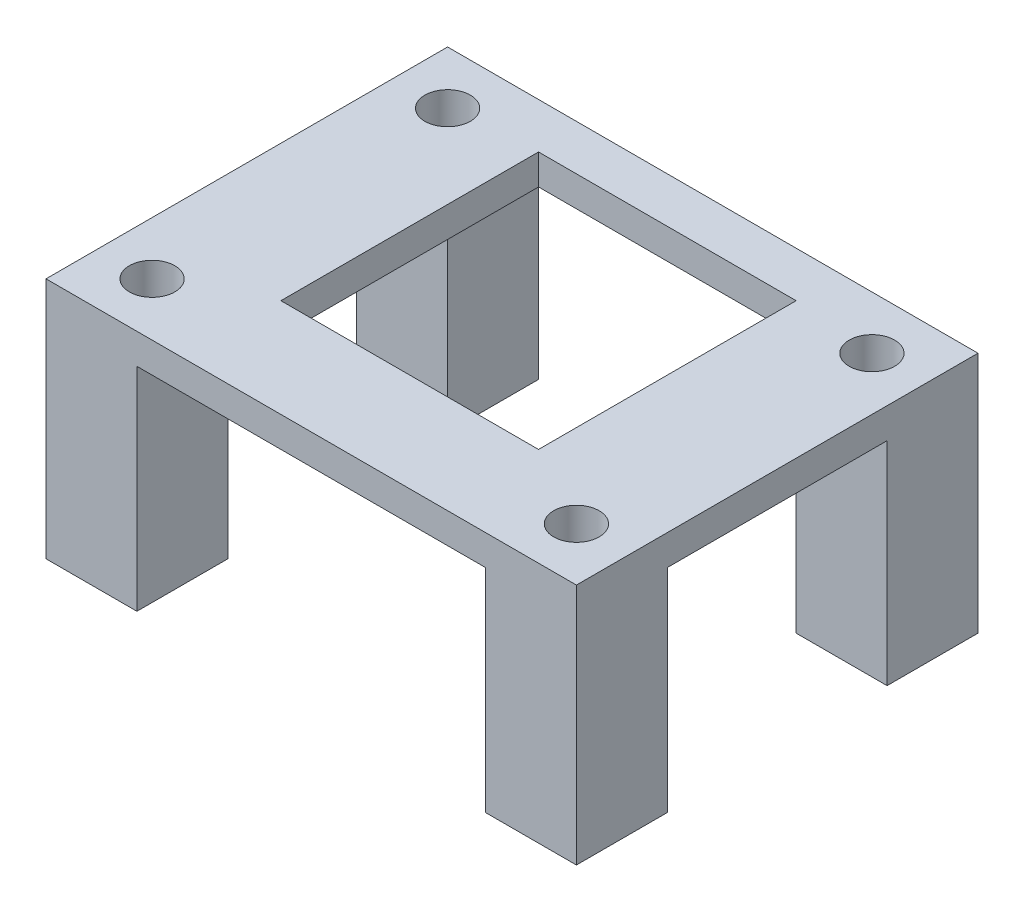
ISO-10303-21;
HEADER;
FILE_DESCRIPTION(('STEP AP214'),'2;1');
FILE_NAME('part.step','',(''),(''),'','','');
FILE_SCHEMA(('AUTOMOTIVE_DESIGN { 1 0 10303 214 1 1 1 1 }'));
ENDSEC;
DATA;
#1=APPLICATION_CONTEXT('core data for automotive mechanical design processes');
#2=APPLICATION_PROTOCOL_DEFINITION('international standard','automotive_design',2000,#1);
#3=PRODUCT_CONTEXT('',#1,'mechanical');
#4=PRODUCT('Part','Part','',(#3));
#5=PRODUCT_RELATED_PRODUCT_CATEGORY('part','',(#4));
#6=PRODUCT_DEFINITION_FORMATION('','',#4);
#7=PRODUCT_DEFINITION_CONTEXT('part definition',#1,'design');
#8=PRODUCT_DEFINITION('design','',#6,#7);
#9=PRODUCT_DEFINITION_SHAPE('','',#8);
#10=(LENGTH_UNIT() NAMED_UNIT(*) SI_UNIT(.MILLI.,.METRE.));
#11=(NAMED_UNIT(*) PLANE_ANGLE_UNIT() SI_UNIT($,.RADIAN.));
#12=(NAMED_UNIT(*) SI_UNIT($,.STERADIAN.) SOLID_ANGLE_UNIT());
#13=UNCERTAINTY_MEASURE_WITH_UNIT(LENGTH_MEASURE(1.E-05),#10,'distance_accuracy_value','');
#14=(GEOMETRIC_REPRESENTATION_CONTEXT(3) GLOBAL_UNCERTAINTY_ASSIGNED_CONTEXT((#13)) GLOBAL_UNIT_ASSIGNED_CONTEXT((#10,
#11,#12)) REPRESENTATION_CONTEXT('',''));
#15=CARTESIAN_POINT('',(0.,0.,0.));
#16=DIRECTION('',(0.,0.,1.));
#17=DIRECTION('',(1.,0.,0.));
#18=AXIS2_PLACEMENT_3D('',#15,#16,#17);
#19=CARTESIAN_POINT('',(0.,5.,0.));
#20=DIRECTION('',(0.,1.,0.));
#21=DIRECTION('',(0.,0.,1.));
#22=AXIS2_PLACEMENT_3D('',#19,#20,#21);
#23=PLANE('',#22);
#24=DIRECTION('',(0.,0.,1.));
#25=VECTOR('',#24,1.);
#26=CARTESIAN_POINT('',(-35.,5.,0.));
#27=LINE('',#26,#25);
#28=CARTESIAN_POINT('',(-35.,5.,-31.25));
#29=VERTEX_POINT('',#28);
#30=CARTESIAN_POINT('',(-35.,5.,-25.25));
#31=VERTEX_POINT('',#30);
#32=EDGE_CURVE('E207',#29,#31,#27,.T.);
#33=ORIENTED_EDGE('',*,*,#32,.F.);
#34=DIRECTION('',(1.,0.,0.));
#35=VECTOR('',#34,1.);
#36=CARTESIAN_POINT('',(0.,5.,-31.25));
#37=LINE('',#36,#35);
#38=CARTESIAN_POINT('',(-29.,5.,-31.25));
#39=VERTEX_POINT('',#38);
#40=EDGE_CURVE('E204',#29,#39,#37,.T.);
#41=ORIENTED_EDGE('',*,*,#40,.T.);
#42=DIRECTION('',(0.,0.,1.));
#43=VECTOR('',#42,1.);
#44=CARTESIAN_POINT('',(-29.,5.,0.));
#45=LINE('',#44,#43);
#46=CARTESIAN_POINT('',(-29.,5.,-25.25));
#47=VERTEX_POINT('',#46);
#48=EDGE_CURVE('E190',#39,#47,#45,.T.);
#49=ORIENTED_EDGE('',*,*,#48,.T.);
#50=DIRECTION('',(1.,0.,0.));
#51=VECTOR('',#50,1.);
#52=CARTESIAN_POINT('',(0.,5.,-25.25));
#53=LINE('',#52,#51);
#54=EDGE_CURVE('E381',#31,#47,#53,.T.);
#55=ORIENTED_EDGE('',*,*,#54,.F.);
#56=EDGE_LOOP('',(#33,#41,#49,#55));
#57=FACE_BOUND('',#56,.T.);
#58=CARTESIAN_POINT('',(-31.5,5.,-27.75));
#59=DIRECTION('',(0.,1.,0.));
#60=DIRECTION('',(0.,0.,1.));
#61=AXIS2_PLACEMENT_3D('',#58,#59,#60);
#62=CIRCLE('',#61,1.5);
#63=CARTESIAN_POINT('',(-31.5,5.,-26.25));
#64=VERTEX_POINT('',#63);
#65=EDGE_CURVE('E49',#64,#64,#62,.T.);
#66=ORIENTED_EDGE('',*,*,#65,.T.);
#67=EDGE_LOOP('',(#66));
#68=FACE_BOUND('',#67,.T.);
#69=ADVANCED_FACE('F45',(#57,#68),#23,.F.);
#70=DIRECTION('',(1.,0.,0.));
#71=VECTOR('',#70,1.);
#72=CARTESIAN_POINT('',(0.,5.,-4.75));
#73=LINE('',#72,#71);
#74=CARTESIAN_POINT('',(-35.,5.,-4.74999999999999));
#75=VERTEX_POINT('',#74);
#76=CARTESIAN_POINT('',(-29.,5.,-4.75));
#77=VERTEX_POINT('',#76);
#78=EDGE_CURVE('E489',#75,#77,#73,.T.);
#79=ORIENTED_EDGE('',*,*,#78,.F.);
#80=CARTESIAN_POINT('',(-35.,5.,-10.75));
#81=VERTEX_POINT('',#80);
#82=EDGE_CURVE('E485',#81,#75,#27,.T.);
#83=ORIENTED_EDGE('',*,*,#82,.F.);
#84=DIRECTION('',(1.,0.,0.));
#85=VECTOR('',#84,1.);
#86=CARTESIAN_POINT('',(0.,5.,-10.75));
#87=LINE('',#86,#85);
#88=CARTESIAN_POINT('',(-29.,5.,-10.75));
#89=VERTEX_POINT('',#88);
#90=EDGE_CURVE('E201',#81,#89,#87,.T.);
#91=ORIENTED_EDGE('',*,*,#90,.T.);
#92=DIRECTION('',(0.,0.,-1.));
#93=VECTOR('',#92,1.);
#94=CARTESIAN_POINT('',(-29.,5.,0.));
#95=LINE('',#94,#93);
#96=EDGE_CURVE('E496',#77,#89,#95,.T.);
#97=ORIENTED_EDGE('',*,*,#96,.F.);
#98=EDGE_LOOP('',(#79,#83,#91,#97));
#99=FACE_BOUND('',#98,.T.);
#100=CARTESIAN_POINT('',(-31.5,5.,-8.25));
#101=DIRECTION('',(0.,1.,0.));
#102=DIRECTION('',(0.,0.,1.));
#103=AXIS2_PLACEMENT_3D('',#100,#101,#102);
#104=CIRCLE('',#103,1.5);
#105=CARTESIAN_POINT('',(-31.5,5.,-6.75));
#106=VERTEX_POINT('',#105);
#107=EDGE_CURVE('E513',#106,#106,#104,.F.);
#108=ORIENTED_EDGE('',*,*,#107,.F.);
#109=EDGE_LOOP('',(#108));
#110=FACE_BOUND('',#109,.T.);
#111=ADVANCED_FACE('F445',(#99,#110),#23,.F.);
#112=CARTESIAN_POINT('',(-3.50000000000001,5.,-8.25));
#113=DIRECTION('',(0.,1.,0.));
#114=DIRECTION('',(0.,0.,1.));
#115=AXIS2_PLACEMENT_3D('',#112,#113,#114);
#116=CIRCLE('',#115,1.5);
#117=CARTESIAN_POINT('',(-3.50000000000001,5.,-6.75));
#118=VERTEX_POINT('',#117);
#119=EDGE_CURVE('E461',#118,#118,#116,.F.);
#120=ORIENTED_EDGE('',*,*,#119,.F.);
#121=EDGE_LOOP('',(#120));
#122=FACE_BOUND('',#121,.T.);
#123=DIRECTION('',(1.,0.,0.));
#124=VECTOR('',#123,1.);
#125=CARTESIAN_POINT('',(0.,5.,-10.75));
#126=LINE('',#125,#124);
#127=CARTESIAN_POINT('',(-6.,5.,-10.75));
#128=VERTEX_POINT('',#127);
#129=CARTESIAN_POINT('',(0.,5.,-10.75));
#130=VERTEX_POINT('',#129);
#131=EDGE_CURVE('E386',#128,#130,#126,.T.);
#132=ORIENTED_EDGE('',*,*,#131,.T.);
#133=DIRECTION('',(0.,0.,1.));
#134=VECTOR('',#133,1.);
#135=CARTESIAN_POINT('',(0.,5.,0.));
#136=LINE('',#135,#134);
#137=CARTESIAN_POINT('',(0.,5.,-4.75));
#138=VERTEX_POINT('',#137);
#139=EDGE_CURVE('E378',#130,#138,#136,.T.);
#140=ORIENTED_EDGE('',*,*,#139,.T.);
#141=CARTESIAN_POINT('',(-6.,5.,-4.75));
#142=VERTEX_POINT('',#141);
#143=EDGE_CURVE('E481',#142,#138,#73,.T.);
#144=ORIENTED_EDGE('',*,*,#143,.F.);
#145=DIRECTION('',(0.,0.,1.));
#146=VECTOR('',#145,1.);
#147=CARTESIAN_POINT('',(-6.,5.,0.));
#148=LINE('',#147,#146);
#149=EDGE_CURVE('E466',#128,#142,#148,.T.);
#150=ORIENTED_EDGE('',*,*,#149,.F.);
#151=EDGE_LOOP('',(#132,#140,#144,#150));
#152=FACE_BOUND('',#151,.T.);
#153=ADVANCED_FACE('F447',(#122,#152),#23,.F.);
#154=CARTESIAN_POINT('',(-3.50000000000001,5.,-27.75));
#155=DIRECTION('',(0.,1.,0.));
#156=DIRECTION('',(0.,0.,1.));
#157=AXIS2_PLACEMENT_3D('',#154,#155,#156);
#158=CIRCLE('',#157,1.5);
#159=CARTESIAN_POINT('',(-3.50000000000001,5.,-26.25));
#160=VERTEX_POINT('',#159);
#161=EDGE_CURVE('E506',#160,#160,#158,.F.);
#162=ORIENTED_EDGE('',*,*,#161,.F.);
#163=EDGE_LOOP('',(#162));
#164=FACE_BOUND('',#163,.T.);
#165=DIRECTION('',(-1.,0.,0.));
#166=VECTOR('',#165,1.);
#167=CARTESIAN_POINT('',(0.,5.,-25.25));
#168=LINE('',#167,#166);
#169=CARTESIAN_POINT('',(0.,5.,-25.25));
#170=VERTEX_POINT('',#169);
#171=CARTESIAN_POINT('',(-6.,5.,-25.25));
#172=VERTEX_POINT('',#171);
#173=EDGE_CURVE('E212',#170,#172,#168,.T.);
#174=ORIENTED_EDGE('',*,*,#173,.T.);
#175=DIRECTION('',(0.,0.,1.));
#176=VECTOR('',#175,1.);
#177=CARTESIAN_POINT('',(-5.99999999999998,5.,0.));
#178=LINE('',#177,#176);
#179=CARTESIAN_POINT('',(-6.,5.,-31.25));
#180=VERTEX_POINT('',#179);
#181=EDGE_CURVE('E491',#180,#172,#178,.T.);
#182=ORIENTED_EDGE('',*,*,#181,.F.);
#183=CARTESIAN_POINT('',(0.,5.,-31.25));
#184=VERTEX_POINT('',#183);
#185=EDGE_CURVE('E213',#180,#184,#37,.T.);
#186=ORIENTED_EDGE('',*,*,#185,.T.);
#187=EDGE_CURVE('E200',#184,#170,#136,.T.);
#188=ORIENTED_EDGE('',*,*,#187,.T.);
#189=EDGE_LOOP('',(#174,#182,#186,#188));
#190=FACE_BOUND('',#189,.T.);
#191=ADVANCED_FACE('F446',(#164,#190),#23,.F.);
#192=CARTESIAN_POINT('',(0.,0.,0.));
#193=DIRECTION('',(1.,0.,0.));
#194=DIRECTION('',(0.,0.,-1.));
#195=AXIS2_PLACEMENT_3D('',#192,#193,#194);
#196=PLANE('',#195);
#197=ORIENTED_EDGE('',*,*,#139,.F.);
#198=DIRECTION('',(0.,1.,0.));
#199=VECTOR('',#198,1.);
#200=CARTESIAN_POINT('',(0.,0.,-10.75));
#201=LINE('',#200,#199);
#202=CARTESIAN_POINT('',(0.,19.,-10.75));
#203=VERTEX_POINT('',#202);
#204=EDGE_CURVE('E265',#130,#203,#201,.T.);
#205=ORIENTED_EDGE('',*,*,#204,.T.);
#206=DIRECTION('',(0.,0.,-1.));
#207=VECTOR('',#206,1.);
#208=CARTESIAN_POINT('',(0.,19.,-10.75));
#209=LINE('',#208,#207);
#210=CARTESIAN_POINT('',(0.,19.,-25.25));
#211=VERTEX_POINT('',#210);
#212=EDGE_CURVE('E301',#203,#211,#209,.T.);
#213=ORIENTED_EDGE('',*,*,#212,.T.);
#214=DIRECTION('',(0.,-1.,0.));
#215=VECTOR('',#214,1.);
#216=CARTESIAN_POINT('',(0.,21.,-25.25));
#217=LINE('',#216,#215);
#218=EDGE_CURVE('E286',#211,#170,#217,.T.);
#219=ORIENTED_EDGE('',*,*,#218,.T.);
#220=ORIENTED_EDGE('',*,*,#187,.F.);
#221=DIRECTION('',(0.,-1.,0.));
#222=VECTOR('',#221,1.);
#223=CARTESIAN_POINT('',(0.,21.,-31.25));
#224=LINE('',#223,#222);
#225=CARTESIAN_POINT('',(0.,21.,-31.25));
#226=VERTEX_POINT('',#225);
#227=EDGE_CURVE('E290',#226,#184,#224,.T.);
#228=ORIENTED_EDGE('',*,*,#227,.F.);
#229=DIRECTION('',(0.,0.,-1.));
#230=VECTOR('',#229,1.);
#231=CARTESIAN_POINT('',(0.,21.,0.));
#232=LINE('',#231,#230);
#233=CARTESIAN_POINT('',(0.,21.,-4.75));
#234=VERTEX_POINT('',#233);
#235=EDGE_CURVE('E269',#234,#226,#232,.T.);
#236=ORIENTED_EDGE('',*,*,#235,.F.);
#237=DIRECTION('',(0.,1.,0.));
#238=VECTOR('',#237,1.);
#239=CARTESIAN_POINT('',(0.,0.,-4.75));
#240=LINE('',#239,#238);
#241=EDGE_CURVE('E264',#138,#234,#240,.T.);
#242=ORIENTED_EDGE('',*,*,#241,.F.);
#243=EDGE_LOOP('',(#197,#205,#213,#219,#220,#228,#236,#242));
#244=FACE_BOUND('',#243,.T.);
#245=ADVANCED_FACE('F47',(#244),#196,.T.);
#246=CARTESIAN_POINT('',(-26.,19.,-28.25));
#247=DIRECTION('',(0.,0.,-1.));
#248=DIRECTION('',(-1.,0.,0.));
#249=AXIS2_PLACEMENT_3D('',#246,#247,#248);
#250=PLANE('',#249);
#251=DIRECTION('',(-1.,0.,0.));
#252=VECTOR('',#251,1.);
#253=CARTESIAN_POINT('',(-26.,21.,-28.25));
#254=LINE('',#253,#252);
#255=CARTESIAN_POINT('',(-9.,21.,-28.25));
#256=VERTEX_POINT('',#255);
#257=CARTESIAN_POINT('',(-26.,21.,-28.25));
#258=VERTEX_POINT('',#257);
#259=EDGE_CURVE('E56',#256,#258,#254,.T.);
#260=ORIENTED_EDGE('',*,*,#259,.T.);
#261=DIRECTION('',(0.,1.,0.));
#262=VECTOR('',#261,1.);
#263=CARTESIAN_POINT('',(-26.,19.,-28.25));
#264=LINE('',#263,#262);
#265=CARTESIAN_POINT('',(-26.,19.,-28.25));
#266=VERTEX_POINT('',#265);
#267=EDGE_CURVE('E65',#266,#258,#264,.T.);
#268=ORIENTED_EDGE('',*,*,#267,.F.);
#269=DIRECTION('',(-1.,0.,0.));
#270=VECTOR('',#269,1.);
#271=CARTESIAN_POINT('',(-26.,19.,-28.25));
#272=LINE('',#271,#270);
#273=CARTESIAN_POINT('',(-9.,19.,-28.25));
#274=VERTEX_POINT('',#273);
#275=EDGE_CURVE('E360',#274,#266,#272,.T.);
#276=ORIENTED_EDGE('',*,*,#275,.F.);
#277=DIRECTION('',(0.,1.,0.));
#278=VECTOR('',#277,1.);
#279=CARTESIAN_POINT('',(-9.,19.,-28.25));
#280=LINE('',#279,#278);
#281=EDGE_CURVE('E83',#274,#256,#280,.T.);
#282=ORIENTED_EDGE('',*,*,#281,.T.);
#283=EDGE_LOOP('',(#260,#268,#276,#282));
#284=FACE_BOUND('',#283,.T.);
#285=ADVANCED_FACE('F429',(#284),#250,.F.);
#286=CARTESIAN_POINT('',(-26.,19.,-11.25));
#287=DIRECTION('',(-1.,0.,0.));
#288=DIRECTION('',(0.,0.,1.));
#289=AXIS2_PLACEMENT_3D('',#286,#287,#288);
#290=PLANE('',#289);
#291=DIRECTION('',(0.,0.,1.));
#292=VECTOR('',#291,1.);
#293=CARTESIAN_POINT('',(-26.,21.,-11.25));
#294=LINE('',#293,#292);
#295=CARTESIAN_POINT('',(-26.,21.,-11.25));
#296=VERTEX_POINT('',#295);
#297=EDGE_CURVE('E347',#258,#296,#294,.T.);
#298=ORIENTED_EDGE('',*,*,#297,.T.);
#299=DIRECTION('',(0.,1.,0.));
#300=VECTOR('',#299,1.);
#301=CARTESIAN_POINT('',(-26.,19.,-11.25));
#302=LINE('',#301,#300);
#303=CARTESIAN_POINT('',(-26.,19.,-11.25));
#304=VERTEX_POINT('',#303);
#305=EDGE_CURVE('E77',#304,#296,#302,.T.);
#306=ORIENTED_EDGE('',*,*,#305,.F.);
#307=DIRECTION('',(0.,0.,1.));
#308=VECTOR('',#307,1.);
#309=CARTESIAN_POINT('',(-26.,19.,-11.25));
#310=LINE('',#309,#308);
#311=EDGE_CURVE('E356',#266,#304,#310,.T.);
#312=ORIENTED_EDGE('',*,*,#311,.F.);
#313=ORIENTED_EDGE('',*,*,#267,.T.);
#314=EDGE_LOOP('',(#298,#306,#312,#313));
#315=FACE_BOUND('',#314,.T.);
#316=ADVANCED_FACE('F435',(#315),#290,.F.);
#317=CARTESIAN_POINT('',(-26.,19.,-11.25));
#318=DIRECTION('',(0.,0.,1.));
#319=DIRECTION('',(1.,0.,0.));
#320=AXIS2_PLACEMENT_3D('',#317,#318,#319);
#321=PLANE('',#320);
#322=DIRECTION('',(1.,0.,0.));
#323=VECTOR('',#322,1.);
#324=CARTESIAN_POINT('',(-26.,21.,-11.25));
#325=LINE('',#324,#323);
#326=CARTESIAN_POINT('',(-8.99999999999999,21.,-11.25));
#327=VERTEX_POINT('',#326);
#328=EDGE_CURVE('E344',#296,#327,#325,.T.);
#329=ORIENTED_EDGE('',*,*,#328,.T.);
#330=DIRECTION('',(0.,1.,0.));
#331=VECTOR('',#330,1.);
#332=CARTESIAN_POINT('',(-8.99999999999999,19.,-11.25));
#333=LINE('',#332,#331);
#334=CARTESIAN_POINT('',(-8.99999999999999,19.,-11.25));
#335=VERTEX_POINT('',#334);
#336=EDGE_CURVE('E86',#335,#327,#333,.T.);
#337=ORIENTED_EDGE('',*,*,#336,.F.);
#338=DIRECTION('',(1.,0.,0.));
#339=VECTOR('',#338,1.);
#340=CARTESIAN_POINT('',(-26.,19.,-11.25));
#341=LINE('',#340,#339);
#342=EDGE_CURVE('E337',#304,#335,#341,.T.);
#343=ORIENTED_EDGE('',*,*,#342,.F.);
#344=ORIENTED_EDGE('',*,*,#305,.T.);
#345=EDGE_LOOP('',(#329,#337,#343,#344));
#346=FACE_BOUND('',#345,.T.);
#347=ADVANCED_FACE('F434',(#346),#321,.F.);
#348=CARTESIAN_POINT('',(-8.99999999999999,19.,-11.25));
#349=DIRECTION('',(1.,0.,0.));
#350=DIRECTION('',(0.,0.,-1.));
#351=AXIS2_PLACEMENT_3D('',#348,#349,#350);
#352=PLANE('',#351);
#353=DIRECTION('',(0.,0.,-1.));
#354=VECTOR('',#353,1.);
#355=CARTESIAN_POINT('',(-8.99999999999999,21.,-11.25));
#356=LINE('',#355,#354);
#357=EDGE_CURVE('E12',#327,#256,#356,.T.);
#358=ORIENTED_EDGE('',*,*,#357,.T.);
#359=ORIENTED_EDGE('',*,*,#281,.F.);
#360=DIRECTION('',(0.,0.,-1.));
#361=VECTOR('',#360,1.);
#362=CARTESIAN_POINT('',(-8.99999999999999,19.,-11.25));
#363=LINE('',#362,#361);
#364=EDGE_CURVE('E348',#335,#274,#363,.T.);
#365=ORIENTED_EDGE('',*,*,#364,.F.);
#366=ORIENTED_EDGE('',*,*,#336,.T.);
#367=EDGE_LOOP('',(#358,#359,#365,#366));
#368=FACE_BOUND('',#367,.T.);
#369=ADVANCED_FACE('F427',(#368),#352,.F.);
#370=CARTESIAN_POINT('',(-6.,0.,0.));
#371=DIRECTION('',(1.,0.,0.));
#372=DIRECTION('',(0.,0.,-1.));
#373=AXIS2_PLACEMENT_3D('',#370,#371,#372);
#374=PLANE('',#373);
#375=DIRECTION('',(0.,1.,0.));
#376=VECTOR('',#375,1.);
#377=CARTESIAN_POINT('',(-6.,0.,-10.75));
#378=LINE('',#377,#376);
#379=CARTESIAN_POINT('',(-6.,19.,-10.75));
#380=VERTEX_POINT('',#379);
#381=EDGE_CURVE('E270',#128,#380,#378,.T.);
#382=ORIENTED_EDGE('',*,*,#381,.F.);
#383=ORIENTED_EDGE('',*,*,#149,.T.);
#384=DIRECTION('',(0.,1.,0.));
#385=VECTOR('',#384,1.);
#386=CARTESIAN_POINT('',(-6.,0.,-4.75));
#387=LINE('',#386,#385);
#388=CARTESIAN_POINT('',(-6.,19.,-4.75));
#389=VERTEX_POINT('',#388);
#390=EDGE_CURVE('E372',#142,#389,#387,.T.);
#391=ORIENTED_EDGE('',*,*,#390,.T.);
#392=DIRECTION('',(0.,0.,-1.));
#393=VECTOR('',#392,1.);
#394=CARTESIAN_POINT('',(-6.,19.,-4.75));
#395=LINE('',#394,#393);
#396=EDGE_CURVE('E309',#389,#380,#395,.T.);
#397=ORIENTED_EDGE('',*,*,#396,.T.);
#398=EDGE_LOOP('',(#382,#383,#391,#397));
#399=FACE_BOUND('',#398,.T.);
#400=ADVANCED_FACE('F471',(#399),#374,.F.);
#401=CARTESIAN_POINT('',(-29.,21.,0.));
#402=DIRECTION('',(-1.,0.,0.));
#403=DIRECTION('',(0.,0.,1.));
#404=AXIS2_PLACEMENT_3D('',#401,#402,#403);
#405=PLANE('',#404);
#406=DIRECTION('',(0.,-1.,0.));
#407=VECTOR('',#406,1.);
#408=CARTESIAN_POINT('',(-29.,21.,-4.75));
#409=LINE('',#408,#407);
#410=CARTESIAN_POINT('',(-29.,19.,-4.75));
#411=VERTEX_POINT('',#410);
#412=EDGE_CURVE('E240',#411,#77,#409,.T.);
#413=ORIENTED_EDGE('',*,*,#412,.T.);
#414=ORIENTED_EDGE('',*,*,#96,.T.);
#415=DIRECTION('',(0.,-1.,0.));
#416=VECTOR('',#415,1.);
#417=CARTESIAN_POINT('',(-29.,21.,-10.75));
#418=LINE('',#417,#416);
#419=CARTESIAN_POINT('',(-29.,19.,-10.75));
#420=VERTEX_POINT('',#419);
#421=EDGE_CURVE('E244',#420,#89,#418,.T.);
#422=ORIENTED_EDGE('',*,*,#421,.F.);
#423=DIRECTION('',(0.,0.,1.));
#424=VECTOR('',#423,1.);
#425=CARTESIAN_POINT('',(-29.,19.,-4.75));
#426=LINE('',#425,#424);
#427=EDGE_CURVE('E317',#420,#411,#426,.T.);
#428=ORIENTED_EDGE('',*,*,#427,.T.);
#429=EDGE_LOOP('',(#413,#414,#422,#428));
#430=FACE_BOUND('',#429,.T.);
#431=ADVANCED_FACE('F494',(#430),#405,.F.);
#432=CARTESIAN_POINT('',(0.,0.,-4.75));
#433=DIRECTION('',(0.,0.,-1.));
#434=DIRECTION('',(-1.,0.,0.));
#435=AXIS2_PLACEMENT_3D('',#432,#433,#434);
#436=PLANE('',#435);
#437=DIRECTION('',(0.,-1.,0.));
#438=VECTOR('',#437,1.);
#439=CARTESIAN_POINT('',(-35.,21.,-4.74999999999999));
#440=LINE('',#439,#438);
#441=CARTESIAN_POINT('',(-35.,21.,-4.74999999999999));
#442=VERTEX_POINT('',#441);
#443=EDGE_CURVE('E252',#442,#75,#440,.T.);
#444=ORIENTED_EDGE('',*,*,#443,.T.);
#445=ORIENTED_EDGE('',*,*,#78,.T.);
#446=ORIENTED_EDGE('',*,*,#412,.F.);
#447=DIRECTION('',(1.,0.,0.));
#448=VECTOR('',#447,1.);
#449=CARTESIAN_POINT('',(-6.,19.,-4.75));
#450=LINE('',#449,#448);
#451=EDGE_CURVE('E313',#411,#389,#450,.T.);
#452=ORIENTED_EDGE('',*,*,#451,.T.);
#453=ORIENTED_EDGE('',*,*,#390,.F.);
#454=ORIENTED_EDGE('',*,*,#143,.T.);
#455=ORIENTED_EDGE('',*,*,#241,.T.);
#456=DIRECTION('',(-1.,0.,0.));
#457=VECTOR('',#456,1.);
#458=CARTESIAN_POINT('',(0.,21.,-4.75));
#459=LINE('',#458,#457);
#460=EDGE_CURVE('E260',#234,#442,#459,.T.);
#461=ORIENTED_EDGE('',*,*,#460,.T.);
#462=EDGE_LOOP('',(#444,#445,#446,#452,#453,#454,#455,#461));
#463=FACE_BOUND('',#462,.T.);
#464=ADVANCED_FACE('F480',(#463),#436,.F.);
#465=CARTESIAN_POINT('',(0.,21.,-10.75));
#466=DIRECTION('',(0.,0.,-1.));
#467=DIRECTION('',(-1.,0.,0.));
#468=AXIS2_PLACEMENT_3D('',#465,#466,#467);
#469=PLANE('',#468);
#470=ORIENTED_EDGE('',*,*,#90,.F.);
#471=DIRECTION('',(0.,-1.,0.));
#472=VECTOR('',#471,1.);
#473=CARTESIAN_POINT('',(-35.,21.,-10.75));
#474=LINE('',#473,#472);
#475=CARTESIAN_POINT('',(-35.,19.,-10.75));
#476=VERTEX_POINT('',#475);
#477=EDGE_CURVE('E248',#476,#81,#474,.T.);
#478=ORIENTED_EDGE('',*,*,#477,.F.);
#479=DIRECTION('',(1.,0.,0.));
#480=VECTOR('',#479,1.);
#481=CARTESIAN_POINT('',(-35.,19.,-10.75));
#482=LINE('',#481,#480);
#483=EDGE_CURVE('E320',#476,#420,#482,.T.);
#484=ORIENTED_EDGE('',*,*,#483,.T.);
#485=ORIENTED_EDGE('',*,*,#421,.T.);
#486=EDGE_LOOP('',(#470,#478,#484,#485));
#487=FACE_BOUND('',#486,.T.);
#488=ADVANCED_FACE('F534',(#487),#469,.T.);
#489=CARTESIAN_POINT('',(0.,21.,-25.25));
#490=DIRECTION('',(0.,0.,-1.));
#491=DIRECTION('',(-1.,0.,0.));
#492=AXIS2_PLACEMENT_3D('',#489,#490,#491);
#493=PLANE('',#492);
#494=DIRECTION('',(0.,-1.,0.));
#495=VECTOR('',#494,1.);
#496=CARTESIAN_POINT('',(-35.,21.,-25.25));
#497=LINE('',#496,#495);
#498=CARTESIAN_POINT('',(-35.,19.,-25.25));
#499=VERTEX_POINT('',#498);
#500=EDGE_CURVE('E226',#499,#31,#497,.T.);
#501=ORIENTED_EDGE('',*,*,#500,.T.);
#502=ORIENTED_EDGE('',*,*,#54,.T.);
#503=DIRECTION('',(0.,-1.,0.));
#504=VECTOR('',#503,1.);
#505=CARTESIAN_POINT('',(-29.,21.,-25.25));
#506=LINE('',#505,#504);
#507=CARTESIAN_POINT('',(-29.,19.,-25.25));
#508=VERTEX_POINT('',#507);
#509=EDGE_CURVE('E197',#508,#47,#506,.T.);
#510=ORIENTED_EDGE('',*,*,#509,.F.);
#511=DIRECTION('',(-1.,0.,0.));
#512=VECTOR('',#511,1.);
#513=CARTESIAN_POINT('',(-35.,19.,-25.25));
#514=LINE('',#513,#512);
#515=EDGE_CURVE('E327',#508,#499,#514,.T.);
#516=ORIENTED_EDGE('',*,*,#515,.T.);
#517=EDGE_LOOP('',(#501,#502,#510,#516));
#518=FACE_BOUND('',#517,.T.);
#519=ADVANCED_FACE('F532',(#518),#493,.F.);
#520=CARTESIAN_POINT('',(-29.,21.,0.));
#521=DIRECTION('',(1.,0.,0.));
#522=DIRECTION('',(0.,0.,-1.));
#523=AXIS2_PLACEMENT_3D('',#520,#521,#522);
#524=PLANE('',#523);
#525=ORIENTED_EDGE('',*,*,#48,.F.);
#526=DIRECTION('',(0.,-1.,0.));
#527=VECTOR('',#526,1.);
#528=CARTESIAN_POINT('',(-29.,21.,-31.25));
#529=LINE('',#528,#527);
#530=CARTESIAN_POINT('',(-29.,19.,-31.25));
#531=VERTEX_POINT('',#530);
#532=EDGE_CURVE('E194',#531,#39,#529,.T.);
#533=ORIENTED_EDGE('',*,*,#532,.F.);
#534=DIRECTION('',(0.,0.,1.));
#535=VECTOR('',#534,1.);
#536=CARTESIAN_POINT('',(-29.,19.,-31.25));
#537=LINE('',#536,#535);
#538=EDGE_CURVE('E330',#531,#508,#537,.T.);
#539=ORIENTED_EDGE('',*,*,#538,.T.);
#540=ORIENTED_EDGE('',*,*,#509,.T.);
#541=EDGE_LOOP('',(#525,#533,#539,#540));
#542=FACE_BOUND('',#541,.T.);
#543=ADVANCED_FACE('F192',(#542),#524,.T.);
#544=CARTESIAN_POINT('',(0.,19.,0.));
#545=DIRECTION('',(0.,1.,0.));
#546=DIRECTION('',(0.,0.,1.));
#547=AXIS2_PLACEMENT_3D('',#544,#545,#546);
#548=PLANE('',#547);
#549=ORIENTED_EDGE('',*,*,#342,.T.);
#550=ORIENTED_EDGE('',*,*,#364,.T.);
#551=ORIENTED_EDGE('',*,*,#275,.T.);
#552=ORIENTED_EDGE('',*,*,#311,.T.);
#553=EDGE_LOOP('',(#549,#550,#551,#552));
#554=FACE_BOUND('',#553,.T.);
#555=DIRECTION('',(-1.,0.,0.));
#556=VECTOR('',#555,1.);
#557=CARTESIAN_POINT('',(-6.,19.,-31.25));
#558=LINE('',#557,#556);
#559=CARTESIAN_POINT('',(-6.,19.,-31.25));
#560=VERTEX_POINT('',#559);
#561=EDGE_CURVE('E218',#560,#531,#558,.T.);
#562=ORIENTED_EDGE('',*,*,#561,.F.);
#563=DIRECTION('',(0.,0.,-1.));
#564=VECTOR('',#563,1.);
#565=CARTESIAN_POINT('',(-6.,19.,-31.25));
#566=LINE('',#565,#564);
#567=CARTESIAN_POINT('',(-6.,19.,-25.25));
#568=VERTEX_POINT('',#567);
#569=EDGE_CURVE('E295',#568,#560,#566,.T.);
#570=ORIENTED_EDGE('',*,*,#569,.F.);
#571=DIRECTION('',(-1.,0.,0.));
#572=VECTOR('',#571,1.);
#573=CARTESIAN_POINT('',(0.,19.,-25.25));
#574=LINE('',#573,#572);
#575=EDGE_CURVE('E298',#211,#568,#574,.T.);
#576=ORIENTED_EDGE('',*,*,#575,.F.);
#577=ORIENTED_EDGE('',*,*,#212,.F.);
#578=DIRECTION('',(1.,0.,0.));
#579=VECTOR('',#578,1.);
#580=CARTESIAN_POINT('',(0.,19.,-10.75));
#581=LINE('',#580,#579);
#582=EDGE_CURVE('E305',#380,#203,#581,.T.);
#583=ORIENTED_EDGE('',*,*,#582,.F.);
#584=ORIENTED_EDGE('',*,*,#396,.F.);
#585=ORIENTED_EDGE('',*,*,#451,.F.);
#586=ORIENTED_EDGE('',*,*,#427,.F.);
#587=ORIENTED_EDGE('',*,*,#483,.F.);
#588=DIRECTION('',(0.,0.,1.));
#589=VECTOR('',#588,1.);
#590=CARTESIAN_POINT('',(-35.,19.,-10.75));
#591=LINE('',#590,#589);
#592=EDGE_CURVE('E323',#499,#476,#591,.T.);
#593=ORIENTED_EDGE('',*,*,#592,.F.);
#594=ORIENTED_EDGE('',*,*,#515,.F.);
#595=ORIENTED_EDGE('',*,*,#538,.F.);
#596=EDGE_LOOP('',(#562,#570,#576,#577,#583,#584,#585,#586,#587,#593,#594,#595));
#597=FACE_BOUND('',#596,.T.);
#598=ADVANCED_FACE('F431',(#554,#597),#548,.F.);
#599=CARTESIAN_POINT('',(-5.99999999999998,21.,0.));
#600=DIRECTION('',(1.,0.,0.));
#601=DIRECTION('',(0.,0.,-1.));
#602=AXIS2_PLACEMENT_3D('',#599,#600,#601);
#603=PLANE('',#602);
#604=DIRECTION('',(0.,-1.,0.));
#605=VECTOR('',#604,1.);
#606=CARTESIAN_POINT('',(-6.,21.,-31.25));
#607=LINE('',#606,#605);
#608=EDGE_CURVE('E278',#560,#180,#607,.T.);
#609=ORIENTED_EDGE('',*,*,#608,.T.);
#610=ORIENTED_EDGE('',*,*,#181,.T.);
#611=DIRECTION('',(0.,-1.,0.));
#612=VECTOR('',#611,1.);
#613=CARTESIAN_POINT('',(-6.,21.,-25.25));
#614=LINE('',#613,#612);
#615=EDGE_CURVE('E282',#568,#172,#614,.T.);
#616=ORIENTED_EDGE('',*,*,#615,.F.);
#617=ORIENTED_EDGE('',*,*,#569,.T.);
#618=EDGE_LOOP('',(#609,#610,#616,#617));
#619=FACE_BOUND('',#618,.T.);
#620=ADVANCED_FACE('F412',(#619),#603,.F.);
#621=CARTESIAN_POINT('',(0.,21.,0.));
#622=DIRECTION('',(0.,1.,0.));
#623=DIRECTION('',(0.,0.,1.));
#624=AXIS2_PLACEMENT_3D('',#621,#622,#623);
#625=PLANE('',#624);
#626=CARTESIAN_POINT('',(-31.5,21.,-27.75));
#627=DIRECTION('',(0.,1.,0.));
#628=DIRECTION('',(0.,0.,1.));
#629=AXIS2_PLACEMENT_3D('',#626,#627,#628);
#630=CIRCLE('',#629,1.5);
#631=CARTESIAN_POINT('',(-31.5,21.,-26.25));
#632=VERTEX_POINT('',#631);
#633=EDGE_CURVE('E236',#632,#632,#630,.T.);
#634=ORIENTED_EDGE('',*,*,#633,.F.);
#635=EDGE_LOOP('',(#634));
#636=FACE_BOUND('',#635,.T.);
#637=DIRECTION('',(0.,0.,-1.));
#638=VECTOR('',#637,1.);
#639=CARTESIAN_POINT('',(-35.,21.,0.));
#640=LINE('',#639,#638);
#641=CARTESIAN_POINT('',(-35.,21.,-31.25));
#642=VERTEX_POINT('',#641);
#643=EDGE_CURVE('E232',#442,#642,#640,.T.);
#644=ORIENTED_EDGE('',*,*,#643,.F.);
#645=ORIENTED_EDGE('',*,*,#460,.F.);
#646=ORIENTED_EDGE('',*,*,#235,.T.);
#647=DIRECTION('',(-1.,0.,0.));
#648=VECTOR('',#647,1.);
#649=CARTESIAN_POINT('',(0.,21.,-31.25));
#650=LINE('',#649,#648);
#651=EDGE_CURVE('E224',#226,#642,#650,.T.);
#652=ORIENTED_EDGE('',*,*,#651,.T.);
#653=EDGE_LOOP('',(#644,#645,#646,#652));
#654=FACE_BOUND('',#653,.T.);
#655=CARTESIAN_POINT('',(-31.5,21.,-8.25));
#656=DIRECTION('',(0.,1.,0.));
#657=DIRECTION('',(0.,0.,1.));
#658=AXIS2_PLACEMENT_3D('',#655,#656,#657);
#659=CIRCLE('',#658,1.5);
#660=CARTESIAN_POINT('',(-31.5,21.,-6.75));
#661=VERTEX_POINT('',#660);
#662=EDGE_CURVE('E256',#661,#661,#659,.F.);
#663=ORIENTED_EDGE('',*,*,#662,.T.);
#664=EDGE_LOOP('',(#663));
#665=FACE_BOUND('',#664,.T.);
#666=CARTESIAN_POINT('',(-3.50000000000001,21.,-8.25));
#667=DIRECTION('',(0.,1.,0.));
#668=DIRECTION('',(0.,0.,1.));
#669=AXIS2_PLACEMENT_3D('',#666,#667,#668);
#670=CIRCLE('',#669,1.5);
#671=CARTESIAN_POINT('',(-3.50000000000001,21.,-6.75));
#672=VERTEX_POINT('',#671);
#673=EDGE_CURVE('E274',#672,#672,#670,.T.);
#674=ORIENTED_EDGE('',*,*,#673,.F.);
#675=EDGE_LOOP('',(#674));
#676=FACE_BOUND('',#675,.T.);
#677=CARTESIAN_POINT('',(-3.50000000000001,21.,-27.75));
#678=DIRECTION('',(0.,1.,0.));
#679=DIRECTION('',(0.,0.,1.));
#680=AXIS2_PLACEMENT_3D('',#677,#678,#679);
#681=CIRCLE('',#680,1.5);
#682=CARTESIAN_POINT('',(-3.50000000000001,21.,-26.25));
#683=VERTEX_POINT('',#682);
#684=EDGE_CURVE('E291',#683,#683,#681,.F.);
#685=ORIENTED_EDGE('',*,*,#684,.T.);
#686=EDGE_LOOP('',(#685));
#687=FACE_BOUND('',#686,.T.);
#688=ORIENTED_EDGE('',*,*,#357,.F.);
#689=ORIENTED_EDGE('',*,*,#328,.F.);
#690=ORIENTED_EDGE('',*,*,#297,.F.);
#691=ORIENTED_EDGE('',*,*,#259,.F.);
#692=EDGE_LOOP('',(#688,#689,#690,#691));
#693=FACE_BOUND('',#692,.T.);
#694=ADVANCED_FACE('F408',(#636,#654,#665,#676,#687,#693),#625,.T.);
#695=CARTESIAN_POINT('',(-3.50000000000001,21.,-27.75));
#696=DIRECTION('',(0.,-1.,0.));
#697=DIRECTION('',(0.,0.,-1.));
#698=AXIS2_PLACEMENT_3D('',#695,#696,#697);
#699=CYLINDRICAL_SURFACE('',#698,1.5);
#700=ORIENTED_EDGE('',*,*,#161,.T.);
#701=EDGE_LOOP('',(#700));
#702=FACE_BOUND('',#701,.T.);
#703=ORIENTED_EDGE('',*,*,#684,.F.);
#704=EDGE_LOOP('',(#703));
#705=FACE_BOUND('',#704,.T.);
#706=ADVANCED_FACE('F411',(#702,#705),#699,.F.);
#707=CARTESIAN_POINT('',(-3.50000000000001,0.,-8.25));
#708=DIRECTION('',(0.,1.,0.));
#709=DIRECTION('',(0.,0.,1.));
#710=AXIS2_PLACEMENT_3D('',#707,#708,#709);
#711=CYLINDRICAL_SURFACE('',#710,1.5);
#712=ORIENTED_EDGE('',*,*,#119,.T.);
#713=EDGE_LOOP('',(#712));
#714=FACE_BOUND('',#713,.T.);
#715=ORIENTED_EDGE('',*,*,#673,.T.);
#716=EDGE_LOOP('',(#715));
#717=FACE_BOUND('',#716,.T.);
#718=ADVANCED_FACE('F548',(#714,#717),#711,.F.);
#719=CARTESIAN_POINT('',(-31.5,21.,-8.25));
#720=DIRECTION('',(0.,-1.,0.));
#721=DIRECTION('',(0.,0.,-1.));
#722=AXIS2_PLACEMENT_3D('',#719,#720,#721);
#723=CYLINDRICAL_SURFACE('',#722,1.5);
#724=ORIENTED_EDGE('',*,*,#107,.T.);
#725=EDGE_LOOP('',(#724));
#726=FACE_BOUND('',#725,.T.);
#727=ORIENTED_EDGE('',*,*,#662,.F.);
#728=EDGE_LOOP('',(#727));
#729=FACE_BOUND('',#728,.T.);
#730=ADVANCED_FACE('F404',(#726,#729),#723,.F.);
#731=CARTESIAN_POINT('',(-31.5,21.,-27.75));
#732=DIRECTION('',(0.,-1.,0.));
#733=DIRECTION('',(0.,0.,-1.));
#734=AXIS2_PLACEMENT_3D('',#731,#732,#733);
#735=CYLINDRICAL_SURFACE('',#734,1.5);
#736=ORIENTED_EDGE('',*,*,#65,.F.);
#737=EDGE_LOOP('',(#736));
#738=FACE_BOUND('',#737,.T.);
#739=ORIENTED_EDGE('',*,*,#633,.T.);
#740=EDGE_LOOP('',(#739));
#741=FACE_BOUND('',#740,.T.);
#742=ADVANCED_FACE('F400',(#738,#741),#735,.F.);
#743=CARTESIAN_POINT('',(-35.,0.,0.));
#744=DIRECTION('',(1.,0.,0.));
#745=DIRECTION('',(0.,0.,-1.));
#746=AXIS2_PLACEMENT_3D('',#743,#744,#745);
#747=PLANE('',#746);
#748=DIRECTION('',(0.,-1.,0.));
#749=VECTOR('',#748,1.);
#750=CARTESIAN_POINT('',(-35.,21.,-31.25));
#751=LINE('',#750,#749);
#752=EDGE_CURVE('E220',#642,#29,#751,.T.);
#753=ORIENTED_EDGE('',*,*,#752,.T.);
#754=ORIENTED_EDGE('',*,*,#32,.T.);
#755=ORIENTED_EDGE('',*,*,#500,.F.);
#756=ORIENTED_EDGE('',*,*,#592,.T.);
#757=ORIENTED_EDGE('',*,*,#477,.T.);
#758=ORIENTED_EDGE('',*,*,#82,.T.);
#759=ORIENTED_EDGE('',*,*,#443,.F.);
#760=ORIENTED_EDGE('',*,*,#643,.T.);
#761=EDGE_LOOP('',(#753,#754,#755,#756,#757,#758,#759,#760));
#762=FACE_BOUND('',#761,.T.);
#763=ADVANCED_FACE('F403',(#762),#747,.F.);
#764=CARTESIAN_POINT('',(0.,0.,-31.25));
#765=DIRECTION('',(0.,0.,-1.));
#766=DIRECTION('',(-1.,0.,0.));
#767=AXIS2_PLACEMENT_3D('',#764,#765,#766);
#768=PLANE('',#767);
#769=ORIENTED_EDGE('',*,*,#40,.F.);
#770=ORIENTED_EDGE('',*,*,#752,.F.);
#771=ORIENTED_EDGE('',*,*,#651,.F.);
#772=ORIENTED_EDGE('',*,*,#227,.T.);
#773=ORIENTED_EDGE('',*,*,#185,.F.);
#774=ORIENTED_EDGE('',*,*,#608,.F.);
#775=ORIENTED_EDGE('',*,*,#561,.T.);
#776=ORIENTED_EDGE('',*,*,#532,.T.);
#777=EDGE_LOOP('',(#769,#770,#771,#772,#773,#774,#775,#776));
#778=FACE_BOUND('',#777,.T.);
#779=ADVANCED_FACE('F215',(#778),#768,.T.);
#780=CARTESIAN_POINT('',(0.,21.,-25.25));
#781=DIRECTION('',(0.,0.,1.));
#782=DIRECTION('',(1.,0.,0.));
#783=AXIS2_PLACEMENT_3D('',#780,#781,#782);
#784=PLANE('',#783);
#785=ORIENTED_EDGE('',*,*,#173,.F.);
#786=ORIENTED_EDGE('',*,*,#218,.F.);
#787=ORIENTED_EDGE('',*,*,#575,.T.);
#788=ORIENTED_EDGE('',*,*,#615,.T.);
#789=EDGE_LOOP('',(#785,#786,#787,#788));
#790=FACE_BOUND('',#789,.T.);
#791=ADVANCED_FACE('F529',(#790),#784,.T.);
#792=CARTESIAN_POINT('',(0.,0.,-10.75));
#793=DIRECTION('',(0.,0.,-1.));
#794=DIRECTION('',(-1.,0.,0.));
#795=AXIS2_PLACEMENT_3D('',#792,#793,#794);
#796=PLANE('',#795);
#797=ORIENTED_EDGE('',*,*,#131,.F.);
#798=ORIENTED_EDGE('',*,*,#381,.T.);
#799=ORIENTED_EDGE('',*,*,#582,.T.);
#800=ORIENTED_EDGE('',*,*,#204,.F.);
#801=EDGE_LOOP('',(#797,#798,#799,#800));
#802=FACE_BOUND('',#801,.T.);
#803=ADVANCED_FACE('F469',(#802),#796,.T.);
#804=CLOSED_SHELL('',(#69,#111,#153,#191,#245,#285,#316,#347,#369,#400,#431,#464,#488,#519,#543,
#598,#620,#694,#706,#718,#730,#742,#763,#779,#791,#803));
#805=MANIFOLD_SOLID_BREP('B2',#804);
#806=ADVANCED_BREP_SHAPE_REPRESENTATION('',(#18,#805),#14);
#807=SHAPE_DEFINITION_REPRESENTATION(#9,#806);
ENDSEC;
END-ISO-10303-21;
